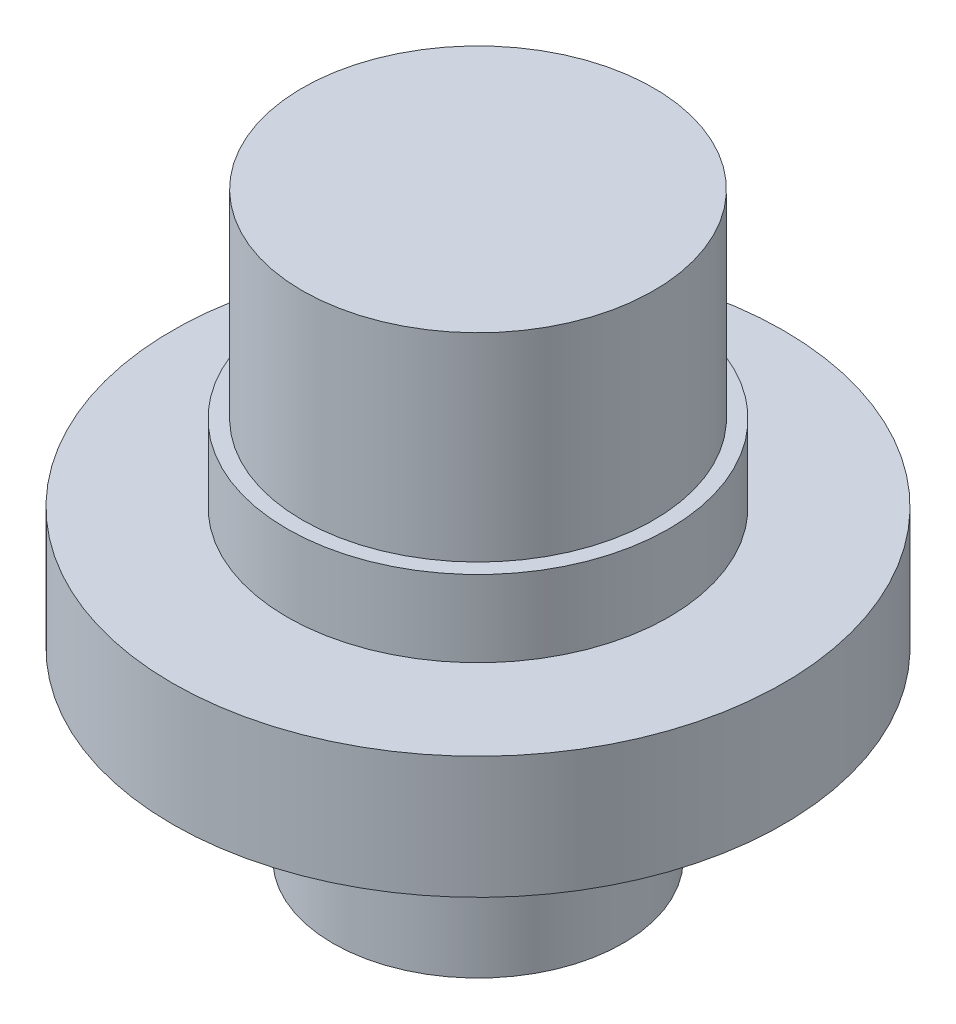
ISO-10303-21;
HEADER;
FILE_DESCRIPTION(('STEP AP214'),'2;1');
FILE_NAME('part.step','',(''),(''),'','','');
FILE_SCHEMA(('AUTOMOTIVE_DESIGN { 1 0 10303 214 1 1 1 1 }'));
ENDSEC;
DATA;
#1=APPLICATION_CONTEXT('core data for automotive mechanical design processes');
#2=APPLICATION_PROTOCOL_DEFINITION('international standard','automotive_design',2000,#1);
#3=PRODUCT_CONTEXT('',#1,'mechanical');
#4=PRODUCT('Part','Part','',(#3));
#5=PRODUCT_RELATED_PRODUCT_CATEGORY('part','',(#4));
#6=PRODUCT_DEFINITION_FORMATION('','',#4);
#7=PRODUCT_DEFINITION_CONTEXT('part definition',#1,'design');
#8=PRODUCT_DEFINITION('design','',#6,#7);
#9=PRODUCT_DEFINITION_SHAPE('','',#8);
#10=(LENGTH_UNIT() NAMED_UNIT(*) SI_UNIT(.MILLI.,.METRE.));
#11=(NAMED_UNIT(*) PLANE_ANGLE_UNIT() SI_UNIT($,.RADIAN.));
#12=(NAMED_UNIT(*) SI_UNIT($,.STERADIAN.) SOLID_ANGLE_UNIT());
#13=UNCERTAINTY_MEASURE_WITH_UNIT(LENGTH_MEASURE(1.E-05),#10,'distance_accuracy_value','');
#14=(GEOMETRIC_REPRESENTATION_CONTEXT(3) GLOBAL_UNCERTAINTY_ASSIGNED_CONTEXT((#13)) GLOBAL_UNIT_ASSIGNED_CONTEXT((#10,
#11,#12)) REPRESENTATION_CONTEXT('',''));
#15=CARTESIAN_POINT('',(0.,0.,0.));
#16=DIRECTION('',(0.,0.,1.));
#17=DIRECTION('',(1.,0.,0.));
#18=AXIS2_PLACEMENT_3D('',#15,#16,#17);
#19=CARTESIAN_POINT('',(0.,12.,0.));
#20=DIRECTION('',(0.,-1.,0.));
#21=DIRECTION('',(0.,0.,-1.));
#22=AXIS2_PLACEMENT_3D('',#19,#20,#21);
#23=CYLINDRICAL_SURFACE('',#22,9.5);
#24=CARTESIAN_POINT('',(0.,12.,0.));
#25=DIRECTION('',(0.,1.,0.));
#26=DIRECTION('',(0.,0.,1.));
#27=AXIS2_PLACEMENT_3D('',#24,#25,#26);
#28=CIRCLE('',#27,9.5);
#29=CARTESIAN_POINT('',(0.,12.,9.5));
#30=VERTEX_POINT('',#29);
#31=EDGE_CURVE('E42',#30,#30,#28,.T.);
#32=ORIENTED_EDGE('',*,*,#31,.F.);
#33=EDGE_LOOP('',(#32));
#34=FACE_BOUND('',#33,.T.);
#35=CARTESIAN_POINT('',(0.,0.,0.));
#36=DIRECTION('',(0.,1.,0.));
#37=DIRECTION('',(0.,0.,1.));
#38=AXIS2_PLACEMENT_3D('',#35,#36,#37);
#39=CIRCLE('',#38,9.5);
#40=CARTESIAN_POINT('',(0.,0.,9.5));
#41=VERTEX_POINT('',#40);
#42=EDGE_CURVE('E33',#41,#41,#39,.T.);
#43=ORIENTED_EDGE('',*,*,#42,.T.);
#44=EDGE_LOOP('',(#43));
#45=FACE_BOUND('',#44,.T.);
#46=ADVANCED_FACE('F30',(#34,#45),#23,.T.);
#47=CARTESIAN_POINT('',(0.,0.,0.));
#48=DIRECTION('',(0.,1.,0.));
#49=DIRECTION('',(0.,0.,1.));
#50=AXIS2_PLACEMENT_3D('',#47,#48,#49);
#51=PLANE('',#50);
#52=ORIENTED_EDGE('',*,*,#42,.F.);
#53=EDGE_LOOP('',(#52));
#54=FACE_BOUND('',#53,.T.);
#55=ADVANCED_FACE('F62',(#54),#51,.F.);
#56=CARTESIAN_POINT('',(0.,20.,0.));
#57=DIRECTION('',(0.,-1.,0.));
#58=DIRECTION('',(0.,0.,-1.));
#59=AXIS2_PLACEMENT_3D('',#56,#57,#58);
#60=CYLINDRICAL_SURFACE('',#59,20.);
#61=CARTESIAN_POINT('',(0.,20.,0.));
#62=DIRECTION('',(0.,1.,0.));
#63=DIRECTION('',(0.,0.,1.));
#64=AXIS2_PLACEMENT_3D('',#61,#62,#63);
#65=CIRCLE('',#64,20.);
#66=CARTESIAN_POINT('',(0.,20.,20.));
#67=VERTEX_POINT('',#66);
#68=EDGE_CURVE('E51',#67,#67,#65,.T.);
#69=ORIENTED_EDGE('',*,*,#68,.F.);
#70=EDGE_LOOP('',(#69));
#71=FACE_BOUND('',#70,.T.);
#72=CARTESIAN_POINT('',(0.,12.,0.));
#73=DIRECTION('',(0.,1.,0.));
#74=DIRECTION('',(0.,0.,1.));
#75=AXIS2_PLACEMENT_3D('',#72,#73,#74);
#76=CIRCLE('',#75,20.);
#77=CARTESIAN_POINT('',(0.,12.,20.));
#78=VERTEX_POINT('',#77);
#79=EDGE_CURVE('E49',#78,#78,#76,.T.);
#80=ORIENTED_EDGE('',*,*,#79,.T.);
#81=EDGE_LOOP('',(#80));
#82=FACE_BOUND('',#81,.T.);
#83=ADVANCED_FACE('F64',(#71,#82),#60,.T.);
#84=CARTESIAN_POINT('',(0.,20.,0.));
#85=DIRECTION('',(0.,1.,0.));
#86=DIRECTION('',(0.,0.,1.));
#87=AXIS2_PLACEMENT_3D('',#84,#85,#86);
#88=PLANE('',#87);
#89=CARTESIAN_POINT('',(0.,20.,0.));
#90=DIRECTION('',(0.,1.,0.));
#91=DIRECTION('',(0.,0.,1.));
#92=AXIS2_PLACEMENT_3D('',#89,#90,#91);
#93=CIRCLE('',#92,12.5);
#94=CARTESIAN_POINT('',(0.,20.,12.5));
#95=VERTEX_POINT('',#94);
#96=EDGE_CURVE('E37',#95,#95,#93,.T.);
#97=ORIENTED_EDGE('',*,*,#96,.F.);
#98=EDGE_LOOP('',(#97));
#99=FACE_BOUND('',#98,.T.);
#100=ORIENTED_EDGE('',*,*,#68,.T.);
#101=EDGE_LOOP('',(#100));
#102=FACE_BOUND('',#101,.T.);
#103=ADVANCED_FACE('F69',(#99,#102),#88,.T.);
#104=CARTESIAN_POINT('',(0.,12.,0.));
#105=DIRECTION('',(0.,1.,0.));
#106=DIRECTION('',(0.,0.,1.));
#107=AXIS2_PLACEMENT_3D('',#104,#105,#106);
#108=PLANE('',#107);
#109=ORIENTED_EDGE('',*,*,#31,.T.);
#110=EDGE_LOOP('',(#109));
#111=FACE_BOUND('',#110,.T.);
#112=ORIENTED_EDGE('',*,*,#79,.F.);
#113=EDGE_LOOP('',(#112));
#114=FACE_BOUND('',#113,.T.);
#115=ADVANCED_FACE('F74',(#111,#114),#108,.F.);
#116=CARTESIAN_POINT('',(0.,25.,0.));
#117=DIRECTION('',(0.,-1.,0.));
#118=DIRECTION('',(0.,0.,-1.));
#119=AXIS2_PLACEMENT_3D('',#116,#117,#118);
#120=CYLINDRICAL_SURFACE('',#119,12.5);
#121=CARTESIAN_POINT('',(0.,25.,0.));
#122=DIRECTION('',(0.,1.,0.));
#123=DIRECTION('',(0.,0.,1.));
#124=AXIS2_PLACEMENT_3D('',#121,#122,#123);
#125=CIRCLE('',#124,12.5);
#126=CARTESIAN_POINT('',(0.,25.,12.5));
#127=VERTEX_POINT('',#126);
#128=EDGE_CURVE('E47',#127,#127,#125,.T.);
#129=ORIENTED_EDGE('',*,*,#128,.F.);
#130=EDGE_LOOP('',(#129));
#131=FACE_BOUND('',#130,.T.);
#132=ORIENTED_EDGE('',*,*,#96,.T.);
#133=EDGE_LOOP('',(#132));
#134=FACE_BOUND('',#133,.T.);
#135=ADVANCED_FACE('F77',(#131,#134),#120,.T.);
#136=CARTESIAN_POINT('',(0.,25.,0.));
#137=DIRECTION('',(0.,1.,0.));
#138=DIRECTION('',(0.,0.,1.));
#139=AXIS2_PLACEMENT_3D('',#136,#137,#138);
#140=PLANE('',#139);
#141=CARTESIAN_POINT('',(0.,25.,0.));
#142=DIRECTION('',(0.,1.,0.));
#143=DIRECTION('',(0.,0.,1.));
#144=AXIS2_PLACEMENT_3D('',#141,#142,#143);
#145=CIRCLE('',#144,11.5);
#146=CARTESIAN_POINT('',(0.,25.,11.5));
#147=VERTEX_POINT('',#146);
#148=EDGE_CURVE('E10',#147,#147,#145,.T.);
#149=ORIENTED_EDGE('',*,*,#148,.F.);
#150=EDGE_LOOP('',(#149));
#151=FACE_BOUND('',#150,.T.);
#152=ORIENTED_EDGE('',*,*,#128,.T.);
#153=EDGE_LOOP('',(#152));
#154=FACE_BOUND('',#153,.T.);
#155=ADVANCED_FACE('F83',(#151,#154),#140,.T.);
#156=CARTESIAN_POINT('',(0.,38.,0.));
#157=DIRECTION('',(0.,-1.,0.));
#158=DIRECTION('',(0.,0.,-1.));
#159=AXIS2_PLACEMENT_3D('',#156,#157,#158);
#160=CYLINDRICAL_SURFACE('',#159,11.5);
#161=CARTESIAN_POINT('',(0.,38.,0.));
#162=DIRECTION('',(0.,1.,0.));
#163=DIRECTION('',(0.,0.,1.));
#164=AXIS2_PLACEMENT_3D('',#161,#162,#163);
#165=CIRCLE('',#164,11.5);
#166=CARTESIAN_POINT('',(0.,38.,11.5));
#167=VERTEX_POINT('',#166);
#168=EDGE_CURVE('E46',#167,#167,#165,.T.);
#169=ORIENTED_EDGE('',*,*,#168,.F.);
#170=EDGE_LOOP('',(#169));
#171=FACE_BOUND('',#170,.T.);
#172=ORIENTED_EDGE('',*,*,#148,.T.);
#173=EDGE_LOOP('',(#172));
#174=FACE_BOUND('',#173,.T.);
#175=ADVANCED_FACE('F87',(#171,#174),#160,.T.);
#176=CARTESIAN_POINT('',(0.,38.,0.));
#177=DIRECTION('',(0.,1.,0.));
#178=DIRECTION('',(0.,0.,1.));
#179=AXIS2_PLACEMENT_3D('',#176,#177,#178);
#180=PLANE('',#179);
#181=ORIENTED_EDGE('',*,*,#168,.T.);
#182=EDGE_LOOP('',(#181));
#183=FACE_BOUND('',#182,.T.);
#184=ADVANCED_FACE('F91',(#183),#180,.T.);
#185=CLOSED_SHELL('',(#46,#55,#83,#103,#115,#135,#155,#175,#184));
#186=MANIFOLD_SOLID_BREP('B2',#185);
#187=ADVANCED_BREP_SHAPE_REPRESENTATION('',(#18,#186),#14);
#188=SHAPE_DEFINITION_REPRESENTATION(#9,#187);
ENDSEC;
END-ISO-10303-21;
